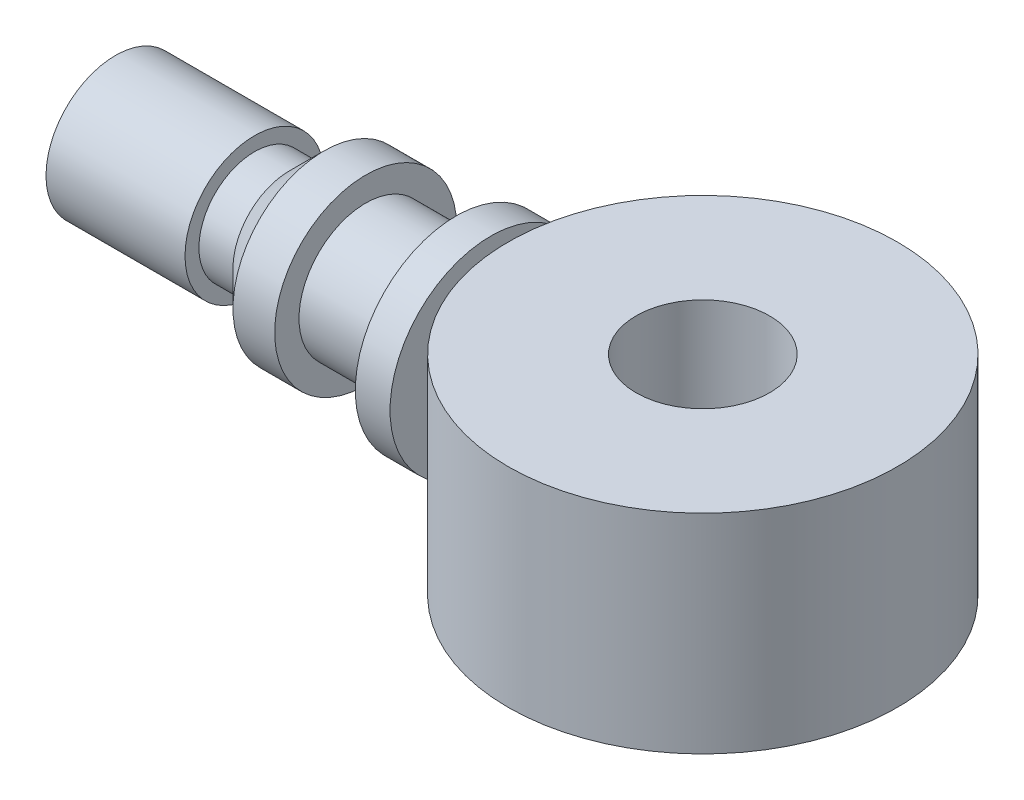
ISO-10303-21;
HEADER;
FILE_DESCRIPTION(('STEP AP214'),'2;1');
FILE_NAME('part.step','',(''),(''),'','','');
FILE_SCHEMA(('AUTOMOTIVE_DESIGN { 1 0 10303 214 1 1 1 1 }'));
ENDSEC;
DATA;
#1=APPLICATION_CONTEXT('core data for automotive mechanical design processes');
#2=APPLICATION_PROTOCOL_DEFINITION('international standard','automotive_design',2000,#1);
#3=PRODUCT_CONTEXT('',#1,'mechanical');
#4=PRODUCT('Part','Part','',(#3));
#5=PRODUCT_RELATED_PRODUCT_CATEGORY('part','',(#4));
#6=PRODUCT_DEFINITION_FORMATION('','',#4);
#7=PRODUCT_DEFINITION_CONTEXT('part definition',#1,'design');
#8=PRODUCT_DEFINITION('design','',#6,#7);
#9=PRODUCT_DEFINITION_SHAPE('','',#8);
#10=(LENGTH_UNIT() NAMED_UNIT(*) SI_UNIT(.MILLI.,.METRE.));
#11=(NAMED_UNIT(*) PLANE_ANGLE_UNIT() SI_UNIT($,.RADIAN.));
#12=(NAMED_UNIT(*) SI_UNIT($,.STERADIAN.) SOLID_ANGLE_UNIT());
#13=UNCERTAINTY_MEASURE_WITH_UNIT(LENGTH_MEASURE(1.E-05),#10,'distance_accuracy_value','');
#14=(GEOMETRIC_REPRESENTATION_CONTEXT(3) GLOBAL_UNCERTAINTY_ASSIGNED_CONTEXT((#13)) GLOBAL_UNIT_ASSIGNED_CONTEXT((#10,
#11,#12)) REPRESENTATION_CONTEXT('',''));
#15=CARTESIAN_POINT('',(0.,0.,0.));
#16=DIRECTION('',(0.,0.,1.));
#17=DIRECTION('',(1.,0.,0.));
#18=AXIS2_PLACEMENT_3D('',#15,#16,#17);
#19=CARTESIAN_POINT('',(58.375,-42.25,-17.125));
#20=DIRECTION('',(1.,0.,0.));
#21=DIRECTION('',(0.,0.,-1.));
#22=AXIS2_PLACEMENT_3D('',#19,#20,#21);
#23=CYLINDRICAL_SURFACE('',#22,2.);
#24=CARTESIAN_POINT('',(50.75,-42.25,-17.125));
#25=DIRECTION('',(1.,0.,0.));
#26=DIRECTION('',(0.,0.,-1.));
#27=AXIS2_PLACEMENT_3D('',#24,#25,#26);
#28=CIRCLE('',#27,2.);
#29=CARTESIAN_POINT('',(50.75,-42.25,-19.125));
#30=VERTEX_POINT('',#29);
#31=EDGE_CURVE('E144',#30,#30,#28,.T.);
#32=ORIENTED_EDGE('',*,*,#31,.T.);
#33=EDGE_LOOP('',(#32));
#34=FACE_BOUND('',#33,.T.);
#35=CARTESIAN_POINT('',(51.6667960675006,-42.25,-19.125));
#36=CARTESIAN_POINT('',(51.6667945299029,-42.1401484621228,-19.1249980204639));
#37=CARTESIAN_POINT('',(51.6640682032079,-42.0302769157455,-19.1159186659955));
#38=CARTESIAN_POINT('',(51.653496107929,-41.813728761137,-19.079923633902));
#39=CARTESIAN_POINT('',(51.6456482570351,-41.7070534708994,-19.0530007013633));
#40=CARTESIAN_POINT('',(51.6257929047845,-41.5000627991285,-18.9822934329287));
#41=CARTESIAN_POINT('',(51.6137918474263,-41.3997378481829,-18.9385352065187));
#42=CARTESIAN_POINT('',(51.5869907890385,-41.2078321884456,-18.8354836406294));
#43=CARTESIAN_POINT('',(51.5721904557481,-41.116252519622,-18.7761884566635));
#44=CARTESIAN_POINT('',(51.5409821678585,-40.9418084346852,-18.641924800982));
#45=CARTESIAN_POINT('',(51.5245424403585,-40.8592321978708,-18.5665892111325));
#46=CARTESIAN_POINT('',(51.4921803448798,-40.7076972166962,-18.4031712454693));
#47=CARTESIAN_POINT('',(51.4762580376635,-40.6387400668772,-18.3150873791596));
#48=CARTESIAN_POINT('',(51.4463666799849,-40.5151713516465,-18.1266460321576));
#49=CARTESIAN_POINT('',(51.4324394549913,-40.460850380249,-18.0260907837619));
#50=CARTESIAN_POINT('',(51.4084745951447,-40.369998225584,-17.8168084752396));
#51=CARTESIAN_POINT('',(51.3984362030913,-40.3334635787597,-17.7080830108752));
#52=CARTESIAN_POINT('',(51.3836048069976,-40.2801655387603,-17.4885585751212));
#53=CARTESIAN_POINT('',(51.378681729887,-40.2629109782953,-17.377887798129));
#54=CARTESIAN_POINT('',(51.3741790434031,-40.2471132661168,-17.1551201024219));
#55=CARTESIAN_POINT('',(51.3745984126102,-40.2485665376626,-17.0430234604115));
#56=CARTESIAN_POINT('',(51.3806399323669,-40.269806374918,-16.8240198042648));
#57=CARTESIAN_POINT('',(51.3861112922395,-40.289061612638,-16.7170564538911));
#58=CARTESIAN_POINT('',(51.4014611366986,-40.3444951024644,-16.5079477778224));
#59=CARTESIAN_POINT('',(51.4113398894378,-40.3806743842621,-16.4058027456995));
#60=CARTESIAN_POINT('',(51.4346096822789,-40.4693094008118,-16.2079261662711));
#61=CARTESIAN_POINT('',(51.4480379448787,-40.5219387778083,-16.1122769561492));
#62=CARTESIAN_POINT('',(51.4769723102596,-40.641844586398,-15.9309927564095));
#63=CARTESIAN_POINT('',(51.4924788680805,-40.7091242276665,-15.845359967584));
#64=CARTESIAN_POINT('',(51.5245431698038,-40.8592057106186,-15.6833673514523));
#65=CARTESIAN_POINT('',(51.5411187063061,-40.942469433605,-15.6074384224151));
#66=CARTESIAN_POINT('',(51.5729702621301,-41.120715091846,-15.4705069842502));
#67=CARTESIAN_POINT('',(51.5882461759463,-41.215697976949,-15.4095056862174));
#68=CARTESIAN_POINT('',(51.6158482518559,-41.415730884498,-15.3037666401455));
#69=CARTESIAN_POINT('',(51.6281498906136,-41.5208552250517,-15.2591626221123));
#70=CARTESIAN_POINT('',(51.6481145561266,-41.7375531635046,-15.1884104850391));
#71=CARTESIAN_POINT('',(51.6557789324646,-41.8491248746599,-15.1622569959729));
#72=CARTESIAN_POINT('',(51.6653088480381,-42.0714804243323,-15.1299258280012));
#73=CARTESIAN_POINT('',(51.6673628868333,-42.182161816933,-15.1230985184265));
#74=CARTESIAN_POINT('',(51.6659584040316,-42.403088315921,-15.1278100328033));
#75=CARTESIAN_POINT('',(51.6625005700743,-42.5133334750109,-15.1393465657536));
#76=CARTESIAN_POINT('',(51.6506456994628,-42.727641228023,-15.1798821857407));
#77=CARTESIAN_POINT('',(51.6423635703455,-42.8317875860152,-15.2084753781586));
#78=CARTESIAN_POINT('',(51.6219093606927,-43.0338018719977,-15.2818483813357));
#79=CARTESIAN_POINT('',(51.6097367188886,-43.1316688916457,-15.3266305277323));
#80=CARTESIAN_POINT('',(51.5824981199061,-43.3210220752168,-15.4323803487838));
#81=CARTESIAN_POINT('',(51.5673680261888,-43.4122904442022,-15.4937210827087));
#82=CARTESIAN_POINT('',(51.5360627345017,-43.5834763734434,-15.6303953631516));
#83=CARTESIAN_POINT('',(51.5198873105239,-43.6633914670121,-15.7057319423186));
#84=CARTESIAN_POINT('',(51.4876527256391,-43.8123794182882,-15.8712919900344));
#85=CARTESIAN_POINT('',(51.4716159395386,-43.8809949714187,-15.9619322897595));
#86=CARTESIAN_POINT('',(51.44202022954,-44.0020456813827,-16.1538146929425));
#87=CARTESIAN_POINT('',(51.4284611761459,-44.0544816839224,-16.2550562419018));
#88=CARTESIAN_POINT('',(51.4054349515359,-44.1411842870263,-16.4645667270438));
#89=CARTESIAN_POINT('',(51.3959369187275,-44.1755883895862,-16.5727752001004));
#90=CARTESIAN_POINT('',(51.3819666037611,-44.2256268019402,-16.7937543514501));
#91=CARTESIAN_POINT('',(51.3774930287698,-44.2412659401813,-16.9065238484146));
#92=CARTESIAN_POINT('',(51.3741466499672,-44.2529914339978,-17.129178237959));
#93=CARTESIAN_POINT('',(51.37508296411,-44.2497441490828,-17.23902563105));
#94=CARTESIAN_POINT('',(51.3820093087786,-44.2253617185897,-17.456545172422));
#95=CARTESIAN_POINT('',(51.3879990972941,-44.204227429618,-17.5642174246175));
#96=CARTESIAN_POINT('',(51.4043119813988,-44.1450686390212,-17.7734041330396));
#97=CARTESIAN_POINT('',(51.4145958595183,-44.107196821056,-17.874965033435));
#98=CARTESIAN_POINT('',(51.4384290585655,-44.0157738417145,-18.0703472027615));
#99=CARTESIAN_POINT('',(51.4519788849822,-43.9622202529078,-18.1641672705807));
#100=CARTESIAN_POINT('',(51.4814104455981,-43.8391026625752,-18.3444334563539));
#101=CARTESIAN_POINT('',(51.4973495421377,-43.7691099132116,-18.4305773280071));
#102=CARTESIAN_POINT('',(51.5295593501347,-43.6158908745461,-18.5901212223184));
#103=CARTESIAN_POINT('',(51.5458301521288,-43.5326609289152,-18.6635177121898));
#104=CARTESIAN_POINT('',(51.5773596245613,-43.3527030830045,-18.7974084602913));
#105=CARTESIAN_POINT('',(51.5925804823151,-43.2556780524965,-18.8575131672359));
#106=CARTESIAN_POINT('',(51.6197155466836,-43.0524781346854,-18.9604794361962));
#107=CARTESIAN_POINT('',(51.6316316028017,-42.9463084089117,-19.0033506488486));
#108=CARTESIAN_POINT('',(51.6494154044341,-42.7423462997673,-19.0659853401247));
#109=CARTESIAN_POINT('',(51.6558756116601,-42.6453096518975,-19.0880589998172));
#110=CARTESIAN_POINT('',(51.6645663053347,-42.4488538816481,-19.117566070437));
#111=CARTESIAN_POINT('',(51.6667974592994,-42.3494351377689,-19.1250017918315));
#112=CARTESIAN_POINT('',(51.6667960675006,-42.25,-19.125));
#113=B_SPLINE_CURVE_WITH_KNOTS('',3,(#35,#36,#37,#38,#39,#40,#41,#42,#43,#44,#45,#46,#47,#48,
#49,#50,#51,#52,#53,#54,#55,#56,#57,#58,#59,#60,#61,#62,#63,#64,#65,#66,#67,#68,#69,#70,#71,#72,
#73,#74,#75,#76,#77,#78,#79,#80,#81,#82,#83,#84,#85,#86,#87,#88,#89,#90,#91,#92,#93,#94,#95,#96,
#97,#98,#99,#100,#101,#102,#103,#104,#105,#106,#107,#108,#109,#110,#111,#112),.UNSPECIFIED.,.T.,
.F.,(4,2,2,2,2,2,2,2,2,2,2,2,2,2,2,2,2,2,2,2,2,2,2,2,2,2,2,2,2,2,2,2,2,2,2,2,2,2,4),(0.,
0.329188342363954,0.658510609618862,0.987324183736438,1.31617681100734,1.65357167206617,
1.99100601238483,2.33471483013847,2.67835669017706,3.01302901028742,3.34763734552418,
3.67257037643421,3.99752317946522,4.32602903378491,4.65460693184835,4.99471612693,
5.3348529062976,5.67770520630006,6.02045767793012,6.35154363333481,6.6825882869845,
7.00605289656512,7.32956419216041,7.66108006042382,7.99266784620105,8.33545388376658,
8.67822200084648,9.0183368529809,9.35836417076639,9.68646897684061,10.0145580709057,
10.3397141238921,10.6649205354322,10.9997976874537,11.3347674991531,11.6785361242131,
12.0221119721565,12.3201328886649,12.61810676147),.UNSPECIFIED.);
#114=CARTESIAN_POINT('',(51.6667960675006,-42.25,-19.125));
#115=VERTEX_POINT('',#114);
#116=EDGE_CURVE('E61',#115,#115,#113,.T.);
#117=ORIENTED_EDGE('',*,*,#116,.F.);
#118=EDGE_LOOP('',(#117));
#119=FACE_BOUND('',#118,.T.);
#120=ADVANCED_FACE('F45',(#34,#119),#23,.T.);
#121=CARTESIAN_POINT('',(43.5,-42.25,0.));
#122=DIRECTION('',(1.,0.,0.));
#123=DIRECTION('',(0.,0.,-1.));
#124=AXIS2_PLACEMENT_3D('',#121,#122,#123);
#125=PLANE('',#124);
#126=CARTESIAN_POINT('',(43.5,-42.25,-17.125));
#127=DIRECTION('',(1.,0.,0.));
#128=DIRECTION('',(0.,0.,-1.));
#129=AXIS2_PLACEMENT_3D('',#126,#127,#128);
#130=CIRCLE('',#129,2.025);
#131=CARTESIAN_POINT('',(43.5,-42.25,-19.15));
#132=VERTEX_POINT('',#131);
#133=EDGE_CURVE('E10',#132,#132,#130,.F.);
#134=ORIENTED_EDGE('',*,*,#133,.T.);
#135=EDGE_LOOP('',(#134));
#136=FACE_BOUND('',#135,.T.);
#137=CARTESIAN_POINT('',(43.5,-42.25,-17.125));
#138=DIRECTION('',(-1.,0.,0.));
#139=DIRECTION('',(0.,0.,1.));
#140=AXIS2_PLACEMENT_3D('',#137,#138,#139);
#141=CIRCLE('',#140,2.);
#142=CARTESIAN_POINT('',(43.5,-42.25,-15.125));
#143=VERTEX_POINT('',#142);
#144=EDGE_CURVE('E57',#143,#143,#141,.T.);
#145=ORIENTED_EDGE('',*,*,#144,.F.);
#146=EDGE_LOOP('',(#145));
#147=FACE_BOUND('',#146,.T.);
#148=ADVANCED_FACE('F104',(#136,#147),#125,.F.);
#149=CARTESIAN_POINT('',(58.375,-42.25,-17.125));
#150=DIRECTION('',(1.,0.,0.));
#151=DIRECTION('',(0.,0.,-1.));
#152=AXIS2_PLACEMENT_3D('',#149,#150,#151);
#153=CYLINDRICAL_SURFACE('',#152,3.275);
#154=CARTESIAN_POINT('',(44.75,-42.25,-17.125));
#155=DIRECTION('',(1.,0.,0.));
#156=DIRECTION('',(0.,0.,-1.));
#157=AXIS2_PLACEMENT_3D('',#154,#155,#156);
#158=CIRCLE('',#157,3.275);
#159=CARTESIAN_POINT('',(44.75,-42.25,-20.4));
#160=VERTEX_POINT('',#159);
#161=EDGE_CURVE('E53',#160,#160,#158,.T.);
#162=ORIENTED_EDGE('',*,*,#161,.T.);
#163=EDGE_LOOP('',(#162));
#164=FACE_BOUND('',#163,.T.);
#165=CARTESIAN_POINT('',(46.25,-42.25,-17.125));
#166=DIRECTION('',(1.,0.,0.));
#167=DIRECTION('',(0.,0.,-1.));
#168=AXIS2_PLACEMENT_3D('',#165,#166,#167);
#169=CIRCLE('',#168,3.275);
#170=CARTESIAN_POINT('',(46.25,-42.25,-20.4));
#171=VERTEX_POINT('',#170);
#172=EDGE_CURVE('E70',#171,#171,#169,.T.);
#173=ORIENTED_EDGE('',*,*,#172,.F.);
#174=EDGE_LOOP('',(#173));
#175=FACE_BOUND('',#174,.T.);
#176=ADVANCED_FACE('F101',(#164,#175),#153,.T.);
#177=CARTESIAN_POINT('',(46.25,-42.25,0.));
#178=DIRECTION('',(-1.,0.,0.));
#179=DIRECTION('',(0.,0.,1.));
#180=AXIS2_PLACEMENT_3D('',#177,#178,#179);
#181=PLANE('',#180);
#182=CARTESIAN_POINT('',(46.25,-42.25,-17.125));
#183=DIRECTION('',(1.,0.,0.));
#184=DIRECTION('',(0.,0.,-1.));
#185=AXIS2_PLACEMENT_3D('',#182,#183,#184);
#186=CIRCLE('',#185,2.4);
#187=CARTESIAN_POINT('',(46.25,-42.25,-19.525));
#188=VERTEX_POINT('',#187);
#189=EDGE_CURVE('E166',#188,#188,#186,.T.);
#190=ORIENTED_EDGE('',*,*,#189,.F.);
#191=EDGE_LOOP('',(#190));
#192=FACE_BOUND('',#191,.T.);
#193=ORIENTED_EDGE('',*,*,#172,.T.);
#194=EDGE_LOOP('',(#193));
#195=FACE_BOUND('',#194,.T.);
#196=ADVANCED_FACE('F97',(#192,#195),#181,.F.);
#197=CARTESIAN_POINT('',(58.375,-42.25,-17.125));
#198=DIRECTION('',(1.,0.,0.));
#199=DIRECTION('',(0.,0.,-1.));
#200=AXIS2_PLACEMENT_3D('',#197,#198,#199);
#201=CYLINDRICAL_SURFACE('',#200,2.4);
#202=CARTESIAN_POINT('',(49.5,-42.25,-17.125));
#203=DIRECTION('',(1.,0.,0.));
#204=DIRECTION('',(0.,0.,-1.));
#205=AXIS2_PLACEMENT_3D('',#202,#203,#204);
#206=CIRCLE('',#205,2.4);
#207=CARTESIAN_POINT('',(49.5,-42.25,-19.525));
#208=VERTEX_POINT('',#207);
#209=EDGE_CURVE('E164',#208,#208,#206,.T.);
#210=ORIENTED_EDGE('',*,*,#209,.F.);
#211=EDGE_LOOP('',(#210));
#212=FACE_BOUND('',#211,.T.);
#213=ORIENTED_EDGE('',*,*,#189,.T.);
#214=EDGE_LOOP('',(#213));
#215=FACE_BOUND('',#214,.T.);
#216=ADVANCED_FACE('F93',(#212,#215),#201,.T.);
#217=CARTESIAN_POINT('',(49.5,-42.25,0.));
#218=DIRECTION('',(1.,0.,0.));
#219=DIRECTION('',(0.,0.,-1.));
#220=AXIS2_PLACEMENT_3D('',#217,#218,#219);
#221=PLANE('',#220);
#222=CARTESIAN_POINT('',(49.5,-42.25,-17.125));
#223=DIRECTION('',(1.,0.,0.));
#224=DIRECTION('',(0.,0.,-1.));
#225=AXIS2_PLACEMENT_3D('',#222,#223,#224);
#226=CIRCLE('',#225,3.625);
#227=CARTESIAN_POINT('',(49.5,-42.25,-20.75));
#228=VERTEX_POINT('',#227);
#229=EDGE_CURVE('E161',#228,#228,#226,.T.);
#230=ORIENTED_EDGE('',*,*,#229,.F.);
#231=EDGE_LOOP('',(#230));
#232=FACE_BOUND('',#231,.T.);
#233=ORIENTED_EDGE('',*,*,#209,.T.);
#234=EDGE_LOOP('',(#233));
#235=FACE_BOUND('',#234,.T.);
#236=ADVANCED_FACE('F89',(#232,#235),#221,.F.);
#237=CARTESIAN_POINT('',(58.375,-42.25,-17.125));
#238=DIRECTION('',(1.,0.,0.));
#239=DIRECTION('',(0.,0.,-1.));
#240=AXIS2_PLACEMENT_3D('',#237,#238,#239);
#241=CYLINDRICAL_SURFACE('',#240,3.625);
#242=CARTESIAN_POINT('',(50.75,-42.25,-17.125));
#243=DIRECTION('',(1.,0.,0.));
#244=DIRECTION('',(0.,0.,-1.));
#245=AXIS2_PLACEMENT_3D('',#242,#243,#244);
#246=CIRCLE('',#245,3.625);
#247=CARTESIAN_POINT('',(50.75,-42.25,-20.75));
#248=VERTEX_POINT('',#247);
#249=EDGE_CURVE('E148',#248,#248,#246,.T.);
#250=ORIENTED_EDGE('',*,*,#249,.F.);
#251=EDGE_LOOP('',(#250));
#252=FACE_BOUND('',#251,.T.);
#253=ORIENTED_EDGE('',*,*,#229,.T.);
#254=EDGE_LOOP('',(#253));
#255=FACE_BOUND('',#254,.T.);
#256=ADVANCED_FACE('F85',(#252,#255),#241,.T.);
#257=CARTESIAN_POINT('',(50.75,-42.25,0.));
#258=DIRECTION('',(-1.,0.,0.));
#259=DIRECTION('',(0.,0.,1.));
#260=AXIS2_PLACEMENT_3D('',#257,#258,#259);
#261=PLANE('',#260);
#262=ORIENTED_EDGE('',*,*,#31,.F.);
#263=EDGE_LOOP('',(#262));
#264=FACE_BOUND('',#263,.T.);
#265=ORIENTED_EDGE('',*,*,#249,.T.);
#266=EDGE_LOOP('',(#265));
#267=FACE_BOUND('',#266,.T.);
#268=ADVANCED_FACE('F80',(#264,#267),#261,.F.);
#269=CARTESIAN_POINT('',(58.375,-18.7010101267767,-17.125));
#270=DIRECTION('',(0.,-1.,0.));
#271=DIRECTION('',(0.,0.,-1.));
#272=AXIS2_PLACEMENT_3D('',#269,#270,#271);
#273=CYLINDRICAL_SURFACE('',#272,7.);
#274=CARTESIAN_POINT('',(58.375,-38.5,-17.125));
#275=DIRECTION('',(0.,1.,0.));
#276=DIRECTION('',(0.,0.,1.));
#277=AXIS2_PLACEMENT_3D('',#274,#275,#276);
#278=CIRCLE('',#277,7.);
#279=CARTESIAN_POINT('',(58.375,-38.5,-10.125));
#280=VERTEX_POINT('',#279);
#281=EDGE_CURVE('E145',#280,#280,#278,.T.);
#282=ORIENTED_EDGE('',*,*,#281,.F.);
#283=EDGE_LOOP('',(#282));
#284=FACE_BOUND('',#283,.T.);
#285=CARTESIAN_POINT('',(58.375,-46.,-17.125));
#286=DIRECTION('',(0.,1.,0.));
#287=DIRECTION('',(0.,0.,1.));
#288=AXIS2_PLACEMENT_3D('',#285,#286,#287);
#289=CIRCLE('',#288,7.);
#290=CARTESIAN_POINT('',(58.375,-46.,-10.125));
#291=VERTEX_POINT('',#290);
#292=EDGE_CURVE('E151',#291,#291,#289,.T.);
#293=ORIENTED_EDGE('',*,*,#292,.T.);
#294=EDGE_LOOP('',(#293));
#295=FACE_BOUND('',#294,.T.);
#296=ORIENTED_EDGE('',*,*,#116,.T.);
#297=EDGE_LOOP('',(#296));
#298=FACE_BOUND('',#297,.T.);
#299=ADVANCED_FACE('F74',(#284,#295,#298),#273,.T.);
#300=CARTESIAN_POINT('',(58.375,-46.,-17.125));
#301=DIRECTION('',(0.,1.,0.));
#302=DIRECTION('',(0.,0.,1.));
#303=AXIS2_PLACEMENT_3D('',#300,#301,#302);
#304=PLANE('',#303);
#305=ORIENTED_EDGE('',*,*,#292,.F.);
#306=EDGE_LOOP('',(#305));
#307=FACE_BOUND('',#306,.T.);
#308=CARTESIAN_POINT('',(58.375,-46.,-17.125));
#309=DIRECTION('',(0.,1.,0.));
#310=DIRECTION('',(0.,0.,1.));
#311=AXIS2_PLACEMENT_3D('',#308,#309,#310);
#312=CIRCLE('',#311,2.4);
#313=CARTESIAN_POINT('',(58.375,-46.,-14.725));
#314=VERTEX_POINT('',#313);
#315=EDGE_CURVE('E140',#314,#314,#312,.T.);
#316=ORIENTED_EDGE('',*,*,#315,.T.);
#317=EDGE_LOOP('',(#316));
#318=FACE_BOUND('',#317,.T.);
#319=ADVANCED_FACE('F79',(#307,#318),#304,.F.);
#320=CARTESIAN_POINT('',(58.375,-18.7010101267767,-17.125));
#321=DIRECTION('',(0.,-1.,0.));
#322=DIRECTION('',(0.,0.,-1.));
#323=AXIS2_PLACEMENT_3D('',#320,#321,#322);
#324=CYLINDRICAL_SURFACE('',#323,2.4);
#325=ORIENTED_EDGE('',*,*,#315,.F.);
#326=EDGE_LOOP('',(#325));
#327=FACE_BOUND('',#326,.T.);
#328=CARTESIAN_POINT('',(58.375,-38.5,-17.125));
#329=DIRECTION('',(0.,1.,0.));
#330=DIRECTION('',(0.,0.,1.));
#331=AXIS2_PLACEMENT_3D('',#328,#329,#330);
#332=CIRCLE('',#331,2.4);
#333=CARTESIAN_POINT('',(58.375,-38.5,-14.725));
#334=VERTEX_POINT('',#333);
#335=EDGE_CURVE('E143',#334,#334,#332,.T.);
#336=ORIENTED_EDGE('',*,*,#335,.T.);
#337=EDGE_LOOP('',(#336));
#338=FACE_BOUND('',#337,.T.);
#339=ADVANCED_FACE('F126',(#327,#338),#324,.F.);
#340=CARTESIAN_POINT('',(65.375,-38.5,0.));
#341=DIRECTION('',(0.,1.,0.));
#342=DIRECTION('',(0.,0.,1.));
#343=AXIS2_PLACEMENT_3D('',#340,#341,#342);
#344=PLANE('',#343);
#345=ORIENTED_EDGE('',*,*,#335,.F.);
#346=EDGE_LOOP('',(#345));
#347=FACE_BOUND('',#346,.T.);
#348=ORIENTED_EDGE('',*,*,#281,.T.);
#349=EDGE_LOOP('',(#348));
#350=FACE_BOUND('',#349,.T.);
#351=ADVANCED_FACE('F116',(#347,#350),#344,.T.);
#352=CARTESIAN_POINT('',(42.25,-42.25,-17.125));
#353=DIRECTION('',(1.,0.,0.));
#354=DIRECTION('',(0.,0.,-1.));
#355=AXIS2_PLACEMENT_3D('',#352,#353,#354);
#356=CYLINDRICAL_SURFACE('',#355,2.);
#357=CARTESIAN_POINT('',(42.25,-42.25,-17.125));
#358=DIRECTION('',(-1.,0.,0.));
#359=DIRECTION('',(0.,0.,1.));
#360=AXIS2_PLACEMENT_3D('',#357,#358,#359);
#361=CIRCLE('',#360,2.);
#362=CARTESIAN_POINT('',(42.25,-42.25,-15.125));
#363=VERTEX_POINT('',#362);
#364=EDGE_CURVE('E156',#363,#363,#361,.T.);
#365=ORIENTED_EDGE('',*,*,#364,.F.);
#366=EDGE_LOOP('',(#365));
#367=FACE_BOUND('',#366,.T.);
#368=ORIENTED_EDGE('',*,*,#144,.T.);
#369=EDGE_LOOP('',(#368));
#370=FACE_BOUND('',#369,.T.);
#371=ADVANCED_FACE('F113',(#367,#370),#356,.T.);
#372=CARTESIAN_POINT('',(37.25,-42.25,-17.125));
#373=DIRECTION('',(1.,0.,0.));
#374=DIRECTION('',(0.,0.,-1.));
#375=AXIS2_PLACEMENT_3D('',#372,#373,#374);
#376=CYLINDRICAL_SURFACE('',#375,2.5);
#377=CARTESIAN_POINT('',(37.25,-42.25,-17.125));
#378=DIRECTION('',(-1.,0.,0.));
#379=DIRECTION('',(0.,0.,1.));
#380=AXIS2_PLACEMENT_3D('',#377,#378,#379);
#381=CIRCLE('',#380,2.5);
#382=CARTESIAN_POINT('',(37.25,-42.25,-14.625));
#383=VERTEX_POINT('',#382);
#384=EDGE_CURVE('E187',#383,#383,#381,.T.);
#385=ORIENTED_EDGE('',*,*,#384,.F.);
#386=EDGE_LOOP('',(#385));
#387=FACE_BOUND('',#386,.T.);
#388=CARTESIAN_POINT('',(42.25,-42.25,-17.125));
#389=DIRECTION('',(-1.,0.,0.));
#390=DIRECTION('',(0.,0.,1.));
#391=AXIS2_PLACEMENT_3D('',#388,#389,#390);
#392=CIRCLE('',#391,2.5);
#393=CARTESIAN_POINT('',(42.25,-42.25,-14.625));
#394=VERTEX_POINT('',#393);
#395=EDGE_CURVE('E190',#394,#394,#392,.T.);
#396=ORIENTED_EDGE('',*,*,#395,.T.);
#397=EDGE_LOOP('',(#396));
#398=FACE_BOUND('',#397,.T.);
#399=ADVANCED_FACE('F115',(#387,#398),#376,.T.);
#400=CARTESIAN_POINT('',(37.25,0.,0.));
#401=DIRECTION('',(-1.,0.,0.));
#402=DIRECTION('',(0.,0.,1.));
#403=AXIS2_PLACEMENT_3D('',#400,#401,#402);
#404=PLANE('',#403);
#405=ORIENTED_EDGE('',*,*,#384,.T.);
#406=EDGE_LOOP('',(#405));
#407=FACE_BOUND('',#406,.T.);
#408=ADVANCED_FACE('F123',(#407),#404,.T.);
#409=CARTESIAN_POINT('',(42.25,0.,0.));
#410=DIRECTION('',(-1.,0.,0.));
#411=DIRECTION('',(0.,0.,1.));
#412=AXIS2_PLACEMENT_3D('',#409,#410,#411);
#413=PLANE('',#412);
#414=ORIENTED_EDGE('',*,*,#364,.T.);
#415=EDGE_LOOP('',(#414));
#416=FACE_BOUND('',#415,.T.);
#417=ORIENTED_EDGE('',*,*,#395,.F.);
#418=EDGE_LOOP('',(#417));
#419=FACE_BOUND('',#418,.T.);
#420=ADVANCED_FACE('F197',(#416,#419),#413,.F.);
#421=CARTESIAN_POINT('',(44.75,-42.25,-17.125));
#422=DIRECTION('',(1.,0.,0.));
#423=DIRECTION('',(0.,0.,-1.));
#424=AXIS2_PLACEMENT_3D('',#421,#422,#423);
#425=CONICAL_SURFACE('',#424,3.275,0.78539816339745);
#426=ORIENTED_EDGE('',*,*,#133,.F.);
#427=EDGE_LOOP('',(#426));
#428=FACE_BOUND('',#427,.T.);
#429=ORIENTED_EDGE('',*,*,#161,.F.);
#430=EDGE_LOOP('',(#429));
#431=FACE_BOUND('',#430,.T.);
#432=ADVANCED_FACE('F48',(#428,#431),#425,.T.);
#433=CLOSED_SHELL('',(#120,#148,#176,#196,#216,#236,#256,#268,#299,#319,#339,#351,#371,#399,
#408,#420,#432));
#434=MANIFOLD_SOLID_BREP('B2',#433);
#435=ADVANCED_BREP_SHAPE_REPRESENTATION('',(#18,#434),#14);
#436=SHAPE_DEFINITION_REPRESENTATION(#9,#435);
ENDSEC;
END-ISO-10303-21;
